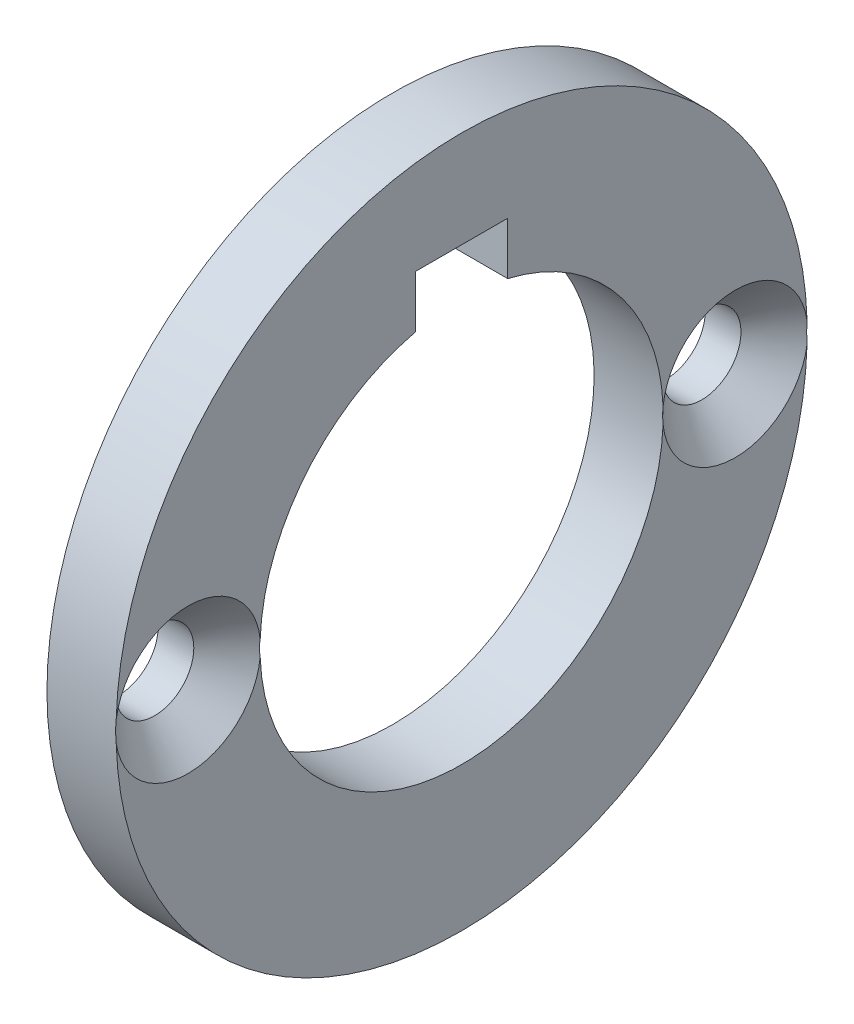
ISO-10303-21;
HEADER;
FILE_DESCRIPTION(('STEP AP214'),'2;1');
FILE_NAME('part.step','',(''),(''),'','','');
FILE_SCHEMA(('AUTOMOTIVE_DESIGN { 1 0 10303 214 1 1 1 1 }'));
ENDSEC;
DATA;
#1=APPLICATION_CONTEXT('core data for automotive mechanical design processes');
#2=APPLICATION_PROTOCOL_DEFINITION('international standard','automotive_design',2000,#1);
#3=PRODUCT_CONTEXT('',#1,'mechanical');
#4=PRODUCT('Part','Part','',(#3));
#5=PRODUCT_RELATED_PRODUCT_CATEGORY('part','',(#4));
#6=PRODUCT_DEFINITION_FORMATION('','',#4);
#7=PRODUCT_DEFINITION_CONTEXT('part definition',#1,'design');
#8=PRODUCT_DEFINITION('design','',#6,#7);
#9=PRODUCT_DEFINITION_SHAPE('','',#8);
#10=(LENGTH_UNIT() NAMED_UNIT(*) SI_UNIT(.MILLI.,.METRE.));
#11=(NAMED_UNIT(*) PLANE_ANGLE_UNIT() SI_UNIT($,.RADIAN.));
#12=(NAMED_UNIT(*) SI_UNIT($,.STERADIAN.) SOLID_ANGLE_UNIT());
#13=UNCERTAINTY_MEASURE_WITH_UNIT(LENGTH_MEASURE(1.E-05),#10,'distance_accuracy_value','');
#14=(GEOMETRIC_REPRESENTATION_CONTEXT(3) GLOBAL_UNCERTAINTY_ASSIGNED_CONTEXT((#13)) GLOBAL_UNIT_ASSIGNED_CONTEXT((#10,
#11,#12)) REPRESENTATION_CONTEXT('',''));
#15=CARTESIAN_POINT('',(0.,0.,0.));
#16=DIRECTION('',(0.,0.,1.));
#17=DIRECTION('',(1.,0.,0.));
#18=AXIS2_PLACEMENT_3D('',#15,#16,#17);
#19=CARTESIAN_POINT('',(0.,8.75,0.));
#20=DIRECTION('',(-1.,0.,0.));
#21=DIRECTION('',(0.,0.,1.));
#22=AXIS2_PLACEMENT_3D('',#19,#20,#21);
#23=PLANE('',#22);
#24=CARTESIAN_POINT('',(0.,0.,0.));
#25=DIRECTION('',(-1.,0.,0.));
#26=DIRECTION('',(0.,0.,1.));
#27=AXIS2_PLACEMENT_3D('',#24,#25,#26);
#28=CIRCLE('',#27,15.);
#29=CARTESIAN_POINT('',(0.,0.445100286716897,14.9933947368421));
#30=VERTEX_POINT('',#29);
#31=CARTESIAN_POINT('',(0.,0.445100286716894,-14.9933947368421));
#32=VERTEX_POINT('',#31);
#33=EDGE_CURVE('E120',#30,#32,#28,.T.);
#34=ORIENTED_EDGE('',*,*,#33,.F.);
#35=CARTESIAN_POINT('',(0.,0.,11.875));
#36=DIRECTION('',(1.,0.,0.));
#37=DIRECTION('',(0.,0.,-1.));
#38=AXIS2_PLACEMENT_3D('',#35,#36,#37);
#39=CIRCLE('',#38,3.15);
#40=CARTESIAN_POINT('',(0.,0.339924220616544,8.7433947368421));
#41=VERTEX_POINT('',#40);
#42=EDGE_CURVE('E56',#41,#30,#39,.T.);
#43=ORIENTED_EDGE('',*,*,#42,.F.);
#44=CARTESIAN_POINT('',(0.,0.,0.));
#45=DIRECTION('',(-1.,0.,0.));
#46=DIRECTION('',(0.,0.,1.));
#47=AXIS2_PLACEMENT_3D('',#44,#45,#46);
#48=CIRCLE('',#47,8.75);
#49=CARTESIAN_POINT('',(0.,8.51836251870041,2.));
#50=VERTEX_POINT('',#49);
#51=EDGE_CURVE('E117',#41,#50,#48,.T.);
#52=ORIENTED_EDGE('',*,*,#51,.T.);
#53=DIRECTION('',(0.,-1.,0.));
#54=VECTOR('',#53,1.);
#55=CARTESIAN_POINT('',(0.,10.7899463712999,2.));
#56=LINE('',#55,#54);
#57=CARTESIAN_POINT('',(0.,10.7899463712999,2.));
#58=VERTEX_POINT('',#57);
#59=EDGE_CURVE('E180',#58,#50,#56,.T.);
#60=ORIENTED_EDGE('',*,*,#59,.F.);
#61=DIRECTION('',(0.,0.,1.));
#62=VECTOR('',#61,1.);
#63=CARTESIAN_POINT('',(0.,10.7899463712999,2.));
#64=LINE('',#63,#62);
#65=CARTESIAN_POINT('',(0.,10.7899463712999,-2.));
#66=VERTEX_POINT('',#65);
#67=EDGE_CURVE('E177',#66,#58,#64,.T.);
#68=ORIENTED_EDGE('',*,*,#67,.F.);
#69=DIRECTION('',(0.,1.,0.));
#70=VECTOR('',#69,1.);
#71=CARTESIAN_POINT('',(0.,10.7899463712999,-2.));
#72=LINE('',#71,#70);
#73=CARTESIAN_POINT('',(0.,8.51836251870041,-2.));
#74=VERTEX_POINT('',#73);
#75=EDGE_CURVE('E182',#74,#66,#72,.T.);
#76=ORIENTED_EDGE('',*,*,#75,.F.);
#77=CARTESIAN_POINT('',(0.,0.339924220616546,-8.7433947368421));
#78=VERTEX_POINT('',#77);
#79=EDGE_CURVE('E128',#74,#78,#48,.T.);
#80=ORIENTED_EDGE('',*,*,#79,.T.);
#81=CARTESIAN_POINT('',(0.,0.,-11.875));
#82=DIRECTION('',(1.,0.,0.));
#83=DIRECTION('',(0.,0.,-1.));
#84=AXIS2_PLACEMENT_3D('',#81,#82,#83);
#85=CIRCLE('',#84,3.15);
#86=EDGE_CURVE('E201',#32,#78,#85,.T.);
#87=ORIENTED_EDGE('',*,*,#86,.F.);
#88=EDGE_LOOP('',(#34,#43,#52,#60,#68,#76,#80,#87));
#89=FACE_BOUND('',#88,.T.);
#90=ADVANCED_FACE('F39',(#89),#23,.F.);
#91=CARTESIAN_POINT('',(0.,-0.339924220616541,-8.7433947368421));
#92=VERTEX_POINT('',#91);
#93=CARTESIAN_POINT('',(0.,-0.339924220616544,8.7433947368421));
#94=VERTEX_POINT('',#93);
#95=EDGE_CURVE('E125',#92,#94,#48,.T.);
#96=ORIENTED_EDGE('',*,*,#95,.T.);
#97=CARTESIAN_POINT('',(0.,-0.44510028671689,14.9933947368421));
#98=VERTEX_POINT('',#97);
#99=EDGE_CURVE('E107',#98,#94,#39,.T.);
#100=ORIENTED_EDGE('',*,*,#99,.F.);
#101=CARTESIAN_POINT('',(0.,-0.445100286716892,-14.9933947368421));
#102=VERTEX_POINT('',#101);
#103=EDGE_CURVE('E126',#102,#98,#28,.T.);
#104=ORIENTED_EDGE('',*,*,#103,.F.);
#105=EDGE_CURVE('E63',#92,#102,#85,.T.);
#106=ORIENTED_EDGE('',*,*,#105,.F.);
#107=EDGE_LOOP('',(#96,#100,#104,#106));
#108=FACE_BOUND('',#107,.T.);
#109=ADVANCED_FACE('F220',(#108),#23,.F.);
#110=CARTESIAN_POINT('',(-34.9249999999999,0.,0.));
#111=DIRECTION('',(-1.,0.,0.));
#112=DIRECTION('',(0.,0.,1.));
#113=AXIS2_PLACEMENT_3D('',#110,#111,#112);
#114=CYLINDRICAL_SURFACE('',#113,8.75);
#115=ORIENTED_EDGE('',*,*,#51,.F.);
#116=CARTESIAN_POINT('',(0.000200000000308003,0.341286130101018,8.74334168252624));
#117=CARTESIAN_POINT('',(-0.0165999999998476,0.227524086734362,8.74778056084206));
#118=CARTESIAN_POINT('',(-0.0249999999999505,0.113762043367701,8.74999999999999));
#119=CARTESIAN_POINT('',(-0.0250000000000509,-0.113762043365628,8.75000000000001));
#120=CARTESIAN_POINT('',(-0.0166000000000484,-0.227524086732296,8.74778056084212));
#121=CARTESIAN_POINT('',(0.000200000000006751,-0.341286130098969,8.74334168252632));
#122=B_SPLINE_CURVE_WITH_KNOTS('',3,(#116,#117,#118,#119,#120,#121),.UNSPECIFIED.,.F.,.F.,(4,2,
4),(0.,0.342279996187651,0.684559992375302),.UNSPECIFIED.);
#123=EDGE_CURVE('E104',#41,#94,#122,.T.);
#124=ORIENTED_EDGE('',*,*,#123,.T.);
#125=ORIENTED_EDGE('',*,*,#95,.F.);
#126=CARTESIAN_POINT('',(0.00020000000000646,-0.341286130098964,-8.74334168252632));
#127=CARTESIAN_POINT('',(-0.0166000000000486,-0.227524086732292,-8.74778056084212));
#128=CARTESIAN_POINT('',(-0.025000000000051,-0.113762043365624,-8.75000000000001));
#129=CARTESIAN_POINT('',(-0.0249999999999504,0.113762043367704,-8.74999999999999));
#130=CARTESIAN_POINT('',(-0.0165999999998474,0.227524086734364,-8.74778056084206));
#131=CARTESIAN_POINT('',(0.000200000000308169,0.34128613010102,-8.74334168252624));
#132=B_SPLINE_CURVE_WITH_KNOTS('',3,(#126,#127,#128,#129,#130,#131),.UNSPECIFIED.,.F.,.F.,(4,2,
4),(0.,0.34227999618765,0.6845599923753),.UNSPECIFIED.);
#133=EDGE_CURVE('E168',#92,#78,#132,.T.);
#134=ORIENTED_EDGE('',*,*,#133,.T.);
#135=ORIENTED_EDGE('',*,*,#79,.F.);
#136=DIRECTION('',(-1.,0.,0.));
#137=VECTOR('',#136,1.);
#138=CARTESIAN_POINT('',(-34.9249999999999,8.51836251870041,-2.));
#139=LINE('',#138,#137);
#140=CARTESIAN_POINT('',(-3.,8.51836251870041,-2.));
#141=VERTEX_POINT('',#140);
#142=EDGE_CURVE('E190',#74,#141,#139,.T.);
#143=ORIENTED_EDGE('',*,*,#142,.T.);
#144=CARTESIAN_POINT('',(-3.,0.,0.));
#145=DIRECTION('',(-1.,0.,0.));
#146=DIRECTION('',(0.,0.,1.));
#147=AXIS2_PLACEMENT_3D('',#144,#145,#146);
#148=CIRCLE('',#147,8.75);
#149=CARTESIAN_POINT('',(-3.,8.51836251870041,2.));
#150=VERTEX_POINT('',#149);
#151=EDGE_CURVE('E193',#141,#150,#148,.T.);
#152=ORIENTED_EDGE('',*,*,#151,.T.);
#153=DIRECTION('',(-1.,0.,0.));
#154=VECTOR('',#153,1.);
#155=CARTESIAN_POINT('',(-34.9249999999999,8.51836251870041,2.));
#156=LINE('',#155,#154);
#157=EDGE_CURVE('E124',#150,#50,#156,.F.);
#158=ORIENTED_EDGE('',*,*,#157,.T.);
#159=EDGE_LOOP('',(#115,#124,#125,#134,#135,#143,#152,#158));
#160=FACE_BOUND('',#159,.T.);
#161=ADVANCED_FACE('F41',(#160),#114,.F.);
#162=CARTESIAN_POINT('',(-34.9249999999999,0.,0.));
#163=DIRECTION('',(-1.,0.,0.));
#164=DIRECTION('',(0.,0.,1.));
#165=AXIS2_PLACEMENT_3D('',#162,#163,#164);
#166=CYLINDRICAL_SURFACE('',#165,15.);
#167=CARTESIAN_POINT('',(-3.,0.,0.));
#168=DIRECTION('',(-1.,0.,0.));
#169=DIRECTION('',(0.,0.,1.));
#170=AXIS2_PLACEMENT_3D('',#167,#168,#169);
#171=CIRCLE('',#170,15.);
#172=CARTESIAN_POINT('',(-3.,0.,15.));
#173=VERTEX_POINT('',#172);
#174=EDGE_CURVE('E195',#173,#173,#171,.T.);
#175=ORIENTED_EDGE('',*,*,#174,.F.);
#176=EDGE_LOOP('',(#175));
#177=FACE_BOUND('',#176,.T.);
#178=ORIENTED_EDGE('',*,*,#103,.T.);
#179=CARTESIAN_POINT('',(0.858646635969858,-2.80927490248727,14.7345843009654));
#180=CARTESIAN_POINT('',(0.819974006315186,-2.74079587255036,14.7476397475614));
#181=CARTESIAN_POINT('',(0.781948792819435,-2.67187463759415,14.7602861404517));
#182=CARTESIAN_POINT('',(0.707386040591589,-2.53306570923559,14.7847404459162));
#183=CARTESIAN_POINT('',(0.670848837484167,-2.46317780250782,14.7965481697685));
#184=CARTESIAN_POINT('',(0.563518647050285,-2.25146330149977,14.830758919575));
#185=CARTESIAN_POINT('',(0.495298057945412,-2.10809475919262,14.8518519512434));
#186=CARTESIAN_POINT('',(0.367476662703526,-1.81596064206667,14.8904040169634));
#187=CARTESIAN_POINT('',(0.307932587982563,-1.66716686278522,14.9078394352114));
#188=CARTESIAN_POINT('',(0.200896618663377,-1.36507443525251,14.9385257186764));
#189=CARTESIAN_POINT('',(0.153383382917392,-1.21178430982356,14.9517840039396));
#190=CARTESIAN_POINT('',(0.0877359216537822,-0.956244006448969,14.9698255724681));
#191=CARTESIAN_POINT('',(0.065162590522503,-0.855227204850519,14.9759460475091));
#192=CARTESIAN_POINT('',(0.027171026857275,-0.651931696648974,14.9861712353563));
#193=CARTESIAN_POINT('',(0.0117401510282027,-0.549655551426825,14.9902795108353));
#194=CARTESIAN_POINT('',(-0.0164308249585389,-0.298776803536279,14.9977546612873));
#195=CARTESIAN_POINT('',(-0.0249812079904415,-0.149640581256184,14.9999950420513));
#196=CARTESIAN_POINT('',(-0.0250187701580157,0.148970396583957,15.0000049522267));
#197=CARTESIAN_POINT('',(-0.0164676301856796,0.29844516109826,14.9977644413761));
#198=CARTESIAN_POINT('',(0.0117442597428587,0.549694822812896,14.990278411001));
#199=CARTESIAN_POINT('',(0.0271821320695852,0.652008764177872,14.9861682795589));
#200=CARTESIAN_POINT('',(0.0651739897375303,0.855270540120419,14.9759429460383));
#201=CARTESIAN_POINT('',(0.0877325772745956,0.956217447040044,14.9698264471223));
#202=CARTESIAN_POINT('',(0.13908822950394,1.15615228834484,14.9557127144794));
#203=CARTESIAN_POINT('',(0.167873743030053,1.25514348446753,14.9477189608064));
#204=CARTESIAN_POINT('',(0.23080353380354,1.45109117528845,14.9299699388227));
#205=CARTESIAN_POINT('',(0.264939785689117,1.54805047453739,14.92021730534));
#206=CARTESIAN_POINT('',(0.301344142581027,1.64400802039434,14.9096357309251));
#207=B_SPLINE_CURVE_WITH_KNOTS('',3,(#179,#180,#181,#182,#183,#184,#185,#186,#187,#188,#189,
#190,#191,#192,#193,#194,#195,#196,#197,#198,#199,#200,#201,#202,#203,#204,#205,#206),
.UNSPECIFIED.,.F.,.F.,(4,2,2,2,2,2,2,2,2,2,2,2,2,4),(0.,0.239152232924364,0.478358111851583,
0.958550450632247,1.4417537690845,1.92409384612316,2.23491847688275,2.54519077379452,
2.99233260467816,3.44047746160575,3.7508695553327,4.06146267102944,4.37148449222755,
4.68104569645887),.UNSPECIFIED.);
#208=EDGE_CURVE('E11',#98,#30,#207,.T.);
#209=ORIENTED_EDGE('',*,*,#208,.T.);
#210=ORIENTED_EDGE('',*,*,#33,.T.);
#211=CARTESIAN_POINT('',(0.301344142581028,1.64400802039435,-14.9096357309251));
#212=CARTESIAN_POINT('',(0.264941386453682,1.54805463503593,-14.9202168410531));
#213=CARTESIAN_POINT('',(0.230806523044435,1.45109963542643,-14.9299690852577));
#214=CARTESIAN_POINT('',(0.167879362509808,1.25516183100581,-14.9477173862808));
#215=CARTESIAN_POINT('',(0.139095028250306,1.15617624345898,-14.9557108287787));
#216=CARTESIAN_POINT('',(0.0877384922575268,0.9562429889781,-14.9698248389415));
#217=CARTESIAN_POINT('',(0.0651784510958082,0.855291887977084,-14.9759417429339));
#218=CARTESIAN_POINT('',(0.0271838447173095,0.652020448438971,-14.986167820917));
#219=CARTESIAN_POINT('',(0.0117447803099625,0.549701016615979,-14.990278262731));
#220=CARTESIAN_POINT('',(-0.0164686883729145,0.298433487986845,-14.9977647368031));
#221=CARTESIAN_POINT('',(-0.0250191880817718,0.14894554602439,-15.0000051248773));
#222=CARTESIAN_POINT('',(-0.0249807850377515,-0.149660635149713,-14.9999948682289));
#223=CARTESIAN_POINT('',(-0.016432761394733,-0.298778904770572,-14.9977549350484));
#224=CARTESIAN_POINT('',(0.0142771290977192,-0.572232426914523,-14.9896065285119));
#225=CARTESIAN_POINT('',(0.0341454161314617,-0.69685514705098,-14.9843146096475));
#226=CARTESIAN_POINT('',(0.0842102113186327,-0.94388649649054,-14.9707845700853));
#227=CARTESIAN_POINT('',(0.114412404472277,-1.0662938679524,-14.9625448275849));
#228=CARTESIAN_POINT('',(0.183793042299283,-1.30905129567501,-14.9432695900614));
#229=CARTESIAN_POINT('',(0.223022834550038,-1.4293851800923,-14.9322180625348));
#230=CARTESIAN_POINT('',(0.308777116931152,-1.6670981057461,-14.907550556895));
#231=CARTESIAN_POINT('',(0.35530050752156,-1.78447758928022,-14.8939349652628));
#232=CARTESIAN_POINT('',(0.471835452514662,-2.0576162062533,-14.859048867911));
#233=CARTESIAN_POINT('',(0.5443186733479,-2.21219079015012,-14.8367775156051));
#234=CARTESIAN_POINT('',(0.658656621375952,-2.43964047053023,-14.8004716520472));
#235=CARTESIAN_POINT('',(0.697477855594209,-2.51432572027617,-14.7879625942014));
#236=CARTESIAN_POINT('',(0.776835853605013,-2.66259931838218,-14.7619857500337));
#237=CARTESIAN_POINT('',(0.817372406424111,-2.73618780014104,-14.7485180814768));
#238=CARTESIAN_POINT('',(0.858646635969856,-2.80927490248727,-14.7345843009654));
#239=B_SPLINE_CURVE_WITH_KNOTS('',3,(#211,#212,#213,#214,#215,#216,#217,#218,#219,#220,#221,
#222,#223,#224,#225,#226,#227,#228,#229,#230,#231,#232,#233,#234,#235,#236,#237,#238),
.UNSPECIFIED.,.F.,.F.,(4,2,2,2,2,2,2,2,2,2,2,2,2,4),(0.,0.309547673318928,0.619552402363041,
0.930158574981957,1.24056823001083,1.68874668544277,2.13585491755368,2.51426474107658,
2.89288307510967,3.27371062300288,3.65448081468637,4.17056467252524,4.42583420810763,
4.68107243787659),.UNSPECIFIED.);
#240=EDGE_CURVE('E49',#32,#102,#239,.T.);
#241=ORIENTED_EDGE('',*,*,#240,.T.);
#242=EDGE_LOOP('',(#178,#209,#210,#241));
#243=FACE_BOUND('',#242,.T.);
#244=ADVANCED_FACE('F153',(#177,#243),#166,.T.);
#245=CARTESIAN_POINT('',(-3.,15.,0.));
#246=DIRECTION('',(1.,0.,0.));
#247=DIRECTION('',(0.,0.,-1.));
#248=AXIS2_PLACEMENT_3D('',#245,#246,#247);
#249=PLANE('',#248);
#250=CARTESIAN_POINT('',(-3.,0.,11.875));
#251=DIRECTION('',(1.,0.,0.));
#252=DIRECTION('',(0.,0.,-1.));
#253=AXIS2_PLACEMENT_3D('',#250,#251,#252);
#254=CIRCLE('',#253,1.7);
#255=CARTESIAN_POINT('',(-3.,0.,10.175));
#256=VERTEX_POINT('',#255);
#257=EDGE_CURVE('E44',#256,#256,#254,.T.);
#258=ORIENTED_EDGE('',*,*,#257,.T.);
#259=EDGE_LOOP('',(#258));
#260=FACE_BOUND('',#259,.T.);
#261=CARTESIAN_POINT('',(-3.,0.,-11.875));
#262=DIRECTION('',(1.,0.,0.));
#263=DIRECTION('',(0.,0.,-1.));
#264=AXIS2_PLACEMENT_3D('',#261,#262,#263);
#265=CIRCLE('',#264,1.7);
#266=CARTESIAN_POINT('',(-3.,0.,-13.575));
#267=VERTEX_POINT('',#266);
#268=EDGE_CURVE('E152',#267,#267,#265,.T.);
#269=ORIENTED_EDGE('',*,*,#268,.T.);
#270=EDGE_LOOP('',(#269));
#271=FACE_BOUND('',#270,.T.);
#272=ORIENTED_EDGE('',*,*,#151,.F.);
#273=DIRECTION('',(0.,1.,0.));
#274=VECTOR('',#273,1.);
#275=CARTESIAN_POINT('',(-3.,15.,-2.));
#276=LINE('',#275,#274);
#277=CARTESIAN_POINT('',(-3.,10.7899463712999,-2.));
#278=VERTEX_POINT('',#277);
#279=EDGE_CURVE('E141',#141,#278,#276,.T.);
#280=ORIENTED_EDGE('',*,*,#279,.T.);
#281=DIRECTION('',(0.,0.,1.));
#282=VECTOR('',#281,1.);
#283=CARTESIAN_POINT('',(-3.,10.7899463712999,0.));
#284=LINE('',#283,#282);
#285=CARTESIAN_POINT('',(-3.,10.7899463712999,2.));
#286=VERTEX_POINT('',#285);
#287=EDGE_CURVE('E137',#278,#286,#284,.T.);
#288=ORIENTED_EDGE('',*,*,#287,.T.);
#289=DIRECTION('',(0.,-1.,0.));
#290=VECTOR('',#289,1.);
#291=CARTESIAN_POINT('',(-3.,15.,2.));
#292=LINE('',#291,#290);
#293=EDGE_CURVE('E133',#286,#150,#292,.T.);
#294=ORIENTED_EDGE('',*,*,#293,.T.);
#295=EDGE_LOOP('',(#272,#280,#288,#294));
#296=FACE_BOUND('',#295,.T.);
#297=ORIENTED_EDGE('',*,*,#174,.T.);
#298=EDGE_LOOP('',(#297));
#299=FACE_BOUND('',#298,.T.);
#300=ADVANCED_FACE('F229',(#260,#271,#296,#299),#249,.F.);
#301=CARTESIAN_POINT('',(-10.,10.7899463712999,2.));
#302=DIRECTION('',(0.,1.,0.));
#303=DIRECTION('',(0.,0.,1.));
#304=AXIS2_PLACEMENT_3D('',#301,#302,#303);
#305=PLANE('',#304);
#306=DIRECTION('',(1.,0.,0.));
#307=VECTOR('',#306,1.);
#308=CARTESIAN_POINT('',(-10.,10.7899463712999,-2.));
#309=LINE('',#308,#307);
#310=EDGE_CURVE('E186',#278,#66,#309,.T.);
#311=ORIENTED_EDGE('',*,*,#310,.T.);
#312=ORIENTED_EDGE('',*,*,#67,.T.);
#313=DIRECTION('',(1.,0.,0.));
#314=VECTOR('',#313,1.);
#315=CARTESIAN_POINT('',(-10.,10.7899463712999,2.));
#316=LINE('',#315,#314);
#317=EDGE_CURVE('E185',#286,#58,#316,.T.);
#318=ORIENTED_EDGE('',*,*,#317,.F.);
#319=ORIENTED_EDGE('',*,*,#287,.F.);
#320=EDGE_LOOP('',(#311,#312,#318,#319));
#321=FACE_BOUND('',#320,.T.);
#322=ADVANCED_FACE('F234',(#321),#305,.F.);
#323=CARTESIAN_POINT('',(-10.,10.7899463712999,-2.));
#324=DIRECTION('',(0.,0.,-1.));
#325=DIRECTION('',(-1.,0.,0.));
#326=AXIS2_PLACEMENT_3D('',#323,#324,#325);
#327=PLANE('',#326);
#328=ORIENTED_EDGE('',*,*,#75,.T.);
#329=ORIENTED_EDGE('',*,*,#310,.F.);
#330=ORIENTED_EDGE('',*,*,#279,.F.);
#331=ORIENTED_EDGE('',*,*,#142,.F.);
#332=EDGE_LOOP('',(#328,#329,#330,#331));
#333=FACE_BOUND('',#332,.T.);
#334=ADVANCED_FACE('F231',(#333),#327,.F.);
#335=CARTESIAN_POINT('',(-10.,10.7899463712999,2.));
#336=DIRECTION('',(0.,0.,1.));
#337=DIRECTION('',(1.,0.,0.));
#338=AXIS2_PLACEMENT_3D('',#335,#336,#337);
#339=PLANE('',#338);
#340=ORIENTED_EDGE('',*,*,#293,.F.);
#341=ORIENTED_EDGE('',*,*,#317,.T.);
#342=ORIENTED_EDGE('',*,*,#59,.T.);
#343=ORIENTED_EDGE('',*,*,#157,.F.);
#344=EDGE_LOOP('',(#340,#341,#342,#343));
#345=FACE_BOUND('',#344,.T.);
#346=ADVANCED_FACE('F237',(#345),#339,.F.);
#347=CARTESIAN_POINT('',(0.,0.,-11.875));
#348=DIRECTION('',(1.,0.,0.));
#349=DIRECTION('',(0.,0.,-1.));
#350=AXIS2_PLACEMENT_3D('',#347,#348,#349);
#351=CYLINDRICAL_SURFACE('',#350,1.7);
#352=CARTESIAN_POINT('',(-1.45,0.,-11.875));
#353=DIRECTION('',(1.,0.,0.));
#354=DIRECTION('',(0.,0.,-1.));
#355=AXIS2_PLACEMENT_3D('',#352,#353,#354);
#356=CIRCLE('',#355,1.7);
#357=CARTESIAN_POINT('',(-1.45,0.,-13.575));
#358=VERTEX_POINT('',#357);
#359=EDGE_CURVE('E175',#358,#358,#356,.T.);
#360=ORIENTED_EDGE('',*,*,#359,.T.);
#361=EDGE_LOOP('',(#360));
#362=FACE_BOUND('',#361,.T.);
#363=ORIENTED_EDGE('',*,*,#268,.F.);
#364=EDGE_LOOP('',(#363));
#365=FACE_BOUND('',#364,.T.);
#366=ADVANCED_FACE('F162',(#362,#365),#351,.F.);
#367=CARTESIAN_POINT('',(0.,0.,-11.875));
#368=DIRECTION('',(1.,0.,0.));
#369=DIRECTION('',(0.,0.,-1.));
#370=AXIS2_PLACEMENT_3D('',#367,#368,#369);
#371=CONICAL_SURFACE('',#370,3.15,0.785398163397449);
#372=ORIENTED_EDGE('',*,*,#359,.F.);
#373=EDGE_LOOP('',(#372));
#374=FACE_BOUND('',#373,.T.);
#375=ORIENTED_EDGE('',*,*,#105,.T.);
#376=ORIENTED_EDGE('',*,*,#240,.F.);
#377=ORIENTED_EDGE('',*,*,#86,.T.);
#378=ORIENTED_EDGE('',*,*,#133,.F.);
#379=EDGE_LOOP('',(#375,#376,#377,#378));
#380=FACE_BOUND('',#379,.T.);
#381=ADVANCED_FACE('F156',(#374,#380),#371,.F.);
#382=CARTESIAN_POINT('',(0.,0.,11.875));
#383=DIRECTION('',(1.,0.,0.));
#384=DIRECTION('',(0.,0.,-1.));
#385=AXIS2_PLACEMENT_3D('',#382,#383,#384);
#386=CYLINDRICAL_SURFACE('',#385,1.7);
#387=CARTESIAN_POINT('',(-1.45,0.,11.875));
#388=DIRECTION('',(1.,0.,0.));
#389=DIRECTION('',(0.,0.,-1.));
#390=AXIS2_PLACEMENT_3D('',#387,#388,#389);
#391=CIRCLE('',#390,1.7);
#392=CARTESIAN_POINT('',(-1.45,0.,10.175));
#393=VERTEX_POINT('',#392);
#394=EDGE_CURVE('E112',#393,#393,#391,.T.);
#395=ORIENTED_EDGE('',*,*,#394,.T.);
#396=EDGE_LOOP('',(#395));
#397=FACE_BOUND('',#396,.T.);
#398=ORIENTED_EDGE('',*,*,#257,.F.);
#399=EDGE_LOOP('',(#398));
#400=FACE_BOUND('',#399,.T.);
#401=ADVANCED_FACE('F161',(#397,#400),#386,.F.);
#402=CARTESIAN_POINT('',(0.,0.,11.875));
#403=DIRECTION('',(1.,0.,0.));
#404=DIRECTION('',(0.,0.,-1.));
#405=AXIS2_PLACEMENT_3D('',#402,#403,#404);
#406=CONICAL_SURFACE('',#405,3.15,0.785398163397449);
#407=ORIENTED_EDGE('',*,*,#394,.F.);
#408=EDGE_LOOP('',(#407));
#409=FACE_BOUND('',#408,.T.);
#410=ORIENTED_EDGE('',*,*,#42,.T.);
#411=ORIENTED_EDGE('',*,*,#208,.F.);
#412=ORIENTED_EDGE('',*,*,#99,.T.);
#413=ORIENTED_EDGE('',*,*,#123,.F.);
#414=EDGE_LOOP('',(#410,#411,#412,#413));
#415=FACE_BOUND('',#414,.T.);
#416=ADVANCED_FACE('F105',(#409,#415),#406,.F.);
#417=CLOSED_SHELL('',(#90,#109,#161,#244,#300,#322,#334,#346,#366,#381,#401,#416));
#418=MANIFOLD_SOLID_BREP('B2',#417);
#419=ADVANCED_BREP_SHAPE_REPRESENTATION('',(#18,#418),#14);
#420=SHAPE_DEFINITION_REPRESENTATION(#9,#419);
ENDSEC;
END-ISO-10303-21;
